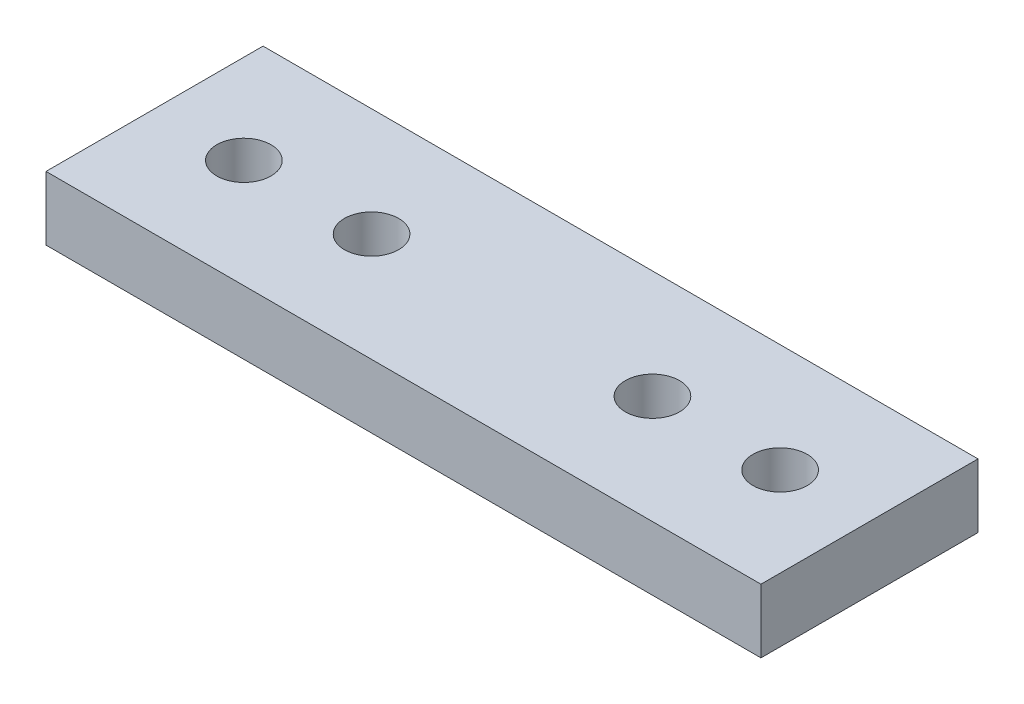
ISO-10303-21;
HEADER;
FILE_DESCRIPTION(('STEP AP214'),'2;1');
FILE_NAME('part.step','',(''),(''),'','','');
FILE_SCHEMA(('AUTOMOTIVE_DESIGN { 1 0 10303 214 1 1 1 1 }'));
ENDSEC;
DATA;
#1=APPLICATION_CONTEXT('core data for automotive mechanical design processes');
#2=APPLICATION_PROTOCOL_DEFINITION('international standard','automotive_design',2000,#1);
#3=PRODUCT_CONTEXT('',#1,'mechanical');
#4=PRODUCT('Part','Part','',(#3));
#5=PRODUCT_RELATED_PRODUCT_CATEGORY('part','',(#4));
#6=PRODUCT_DEFINITION_FORMATION('','',#4);
#7=PRODUCT_DEFINITION_CONTEXT('part definition',#1,'design');
#8=PRODUCT_DEFINITION('design','',#6,#7);
#9=PRODUCT_DEFINITION_SHAPE('','',#8);
#10=(LENGTH_UNIT() NAMED_UNIT(*) SI_UNIT(.MILLI.,.METRE.));
#11=(NAMED_UNIT(*) PLANE_ANGLE_UNIT() SI_UNIT($,.RADIAN.));
#12=(NAMED_UNIT(*) SI_UNIT($,.STERADIAN.) SOLID_ANGLE_UNIT());
#13=UNCERTAINTY_MEASURE_WITH_UNIT(LENGTH_MEASURE(1.E-05),#10,'distance_accuracy_value','');
#14=(GEOMETRIC_REPRESENTATION_CONTEXT(3) GLOBAL_UNCERTAINTY_ASSIGNED_CONTEXT((#13)) GLOBAL_UNIT_ASSIGNED_CONTEXT((#10,
#11,#12)) REPRESENTATION_CONTEXT('',''));
#15=CARTESIAN_POINT('',(0.,0.,0.));
#16=DIRECTION('',(0.,0.,1.));
#17=DIRECTION('',(1.,0.,0.));
#18=AXIS2_PLACEMENT_3D('',#15,#16,#17);
#19=CARTESIAN_POINT('',(0.,10.,0.));
#20=DIRECTION('',(0.,-1.,0.));
#21=DIRECTION('',(0.,0.,-1.));
#22=AXIS2_PLACEMENT_3D('',#19,#20,#21);
#23=PLANE('',#22);
#24=DIRECTION('',(0.,0.,1.));
#25=VECTOR('',#24,1.);
#26=CARTESIAN_POINT('',(-56.,10.,17.));
#27=LINE('',#26,#25);
#28=CARTESIAN_POINT('',(-56.,10.,-17.));
#29=VERTEX_POINT('',#28);
#30=CARTESIAN_POINT('',(-56.,10.,17.));
#31=VERTEX_POINT('',#30);
#32=EDGE_CURVE('E91',#29,#31,#27,.T.);
#33=ORIENTED_EDGE('',*,*,#32,.T.);
#34=DIRECTION('',(1.,0.,0.));
#35=VECTOR('',#34,1.);
#36=CARTESIAN_POINT('',(-56.,10.,17.));
#37=LINE('',#36,#35);
#38=CARTESIAN_POINT('',(56.,10.,17.));
#39=VERTEX_POINT('',#38);
#40=EDGE_CURVE('E86',#31,#39,#37,.T.);
#41=ORIENTED_EDGE('',*,*,#40,.T.);
#42=DIRECTION('',(0.,0.,-1.));
#43=VECTOR('',#42,1.);
#44=CARTESIAN_POINT('',(56.,10.,17.));
#45=LINE('',#44,#43);
#46=CARTESIAN_POINT('',(56.,10.,-17.));
#47=VERTEX_POINT('',#46);
#48=EDGE_CURVE('E87',#39,#47,#45,.T.);
#49=ORIENTED_EDGE('',*,*,#48,.T.);
#50=DIRECTION('',(-1.,0.,0.));
#51=VECTOR('',#50,1.);
#52=CARTESIAN_POINT('',(-56.,10.,-17.));
#53=LINE('',#52,#51);
#54=EDGE_CURVE('E57',#47,#29,#53,.T.);
#55=ORIENTED_EDGE('',*,*,#54,.T.);
#56=EDGE_LOOP('',(#33,#41,#49,#55));
#57=FACE_BOUND('',#56,.T.);
#58=CARTESIAN_POINT('',(-42.,10.,0.));
#59=DIRECTION('',(0.,1.,0.));
#60=DIRECTION('',(0.,0.,1.));
#61=AXIS2_PLACEMENT_3D('',#58,#59,#60);
#62=CIRCLE('',#61,4.25);
#63=CARTESIAN_POINT('',(-42.,10.,4.25));
#64=VERTEX_POINT('',#63);
#65=EDGE_CURVE('E106',#64,#64,#62,.T.);
#66=ORIENTED_EDGE('',*,*,#65,.F.);
#67=EDGE_LOOP('',(#66));
#68=FACE_BOUND('',#67,.T.);
#69=CARTESIAN_POINT('',(42.,10.,0.));
#70=DIRECTION('',(0.,1.,0.));
#71=DIRECTION('',(0.,0.,1.));
#72=AXIS2_PLACEMENT_3D('',#69,#70,#71);
#73=CIRCLE('',#72,4.25);
#74=CARTESIAN_POINT('',(42.,10.,4.25));
#75=VERTEX_POINT('',#74);
#76=EDGE_CURVE('E123',#75,#75,#73,.T.);
#77=ORIENTED_EDGE('',*,*,#76,.F.);
#78=EDGE_LOOP('',(#77));
#79=FACE_BOUND('',#78,.T.);
#80=CARTESIAN_POINT('',(-22.,10.,0.));
#81=DIRECTION('',(0.,1.,0.));
#82=DIRECTION('',(0.,0.,1.));
#83=AXIS2_PLACEMENT_3D('',#80,#81,#82);
#84=CIRCLE('',#83,4.25);
#85=CARTESIAN_POINT('',(-22.,10.,4.25));
#86=VERTEX_POINT('',#85);
#87=EDGE_CURVE('E130',#86,#86,#84,.T.);
#88=ORIENTED_EDGE('',*,*,#87,.F.);
#89=EDGE_LOOP('',(#88));
#90=FACE_BOUND('',#89,.T.);
#91=CARTESIAN_POINT('',(22.,10.,0.));
#92=DIRECTION('',(0.,1.,0.));
#93=DIRECTION('',(0.,0.,1.));
#94=AXIS2_PLACEMENT_3D('',#91,#92,#93);
#95=CIRCLE('',#94,4.25);
#96=CARTESIAN_POINT('',(22.,10.,4.25));
#97=VERTEX_POINT('',#96);
#98=EDGE_CURVE('E133',#97,#97,#95,.T.);
#99=ORIENTED_EDGE('',*,*,#98,.F.);
#100=EDGE_LOOP('',(#99));
#101=FACE_BOUND('',#100,.T.);
#102=ADVANCED_FACE('F39',(#57,#68,#79,#90,#101),#23,.F.);
#103=CARTESIAN_POINT('',(0.,0.,0.));
#104=DIRECTION('',(0.,-1.,0.));
#105=DIRECTION('',(0.,0.,-1.));
#106=AXIS2_PLACEMENT_3D('',#103,#104,#105);
#107=PLANE('',#106);
#108=CARTESIAN_POINT('',(-22.,0.,0.));
#109=DIRECTION('',(0.,1.,0.));
#110=DIRECTION('',(0.,0.,1.));
#111=AXIS2_PLACEMENT_3D('',#108,#109,#110);
#112=CIRCLE('',#111,4.25);
#113=CARTESIAN_POINT('',(-22.,0.,4.25));
#114=VERTEX_POINT('',#113);
#115=EDGE_CURVE('E127',#114,#114,#112,.T.);
#116=ORIENTED_EDGE('',*,*,#115,.T.);
#117=EDGE_LOOP('',(#116));
#118=FACE_BOUND('',#117,.T.);
#119=CARTESIAN_POINT('',(-42.,0.,0.));
#120=DIRECTION('',(0.,1.,0.));
#121=DIRECTION('',(0.,0.,1.));
#122=AXIS2_PLACEMENT_3D('',#119,#120,#121);
#123=CIRCLE('',#122,4.25);
#124=CARTESIAN_POINT('',(-42.,0.,4.25));
#125=VERTEX_POINT('',#124);
#126=EDGE_CURVE('E119',#125,#125,#123,.T.);
#127=ORIENTED_EDGE('',*,*,#126,.T.);
#128=EDGE_LOOP('',(#127));
#129=FACE_BOUND('',#128,.T.);
#130=DIRECTION('',(0.,0.,1.));
#131=VECTOR('',#130,1.);
#132=CARTESIAN_POINT('',(-56.,0.,17.));
#133=LINE('',#132,#131);
#134=CARTESIAN_POINT('',(-56.,0.,-17.));
#135=VERTEX_POINT('',#134);
#136=CARTESIAN_POINT('',(-56.,0.,17.));
#137=VERTEX_POINT('',#136);
#138=EDGE_CURVE('E104',#135,#137,#133,.T.);
#139=ORIENTED_EDGE('',*,*,#138,.F.);
#140=DIRECTION('',(-1.,0.,0.));
#141=VECTOR('',#140,1.);
#142=CARTESIAN_POINT('',(-56.,0.,-17.));
#143=LINE('',#142,#141);
#144=CARTESIAN_POINT('',(56.,0.,-17.));
#145=VERTEX_POINT('',#144);
#146=EDGE_CURVE('E80',#145,#135,#143,.T.);
#147=ORIENTED_EDGE('',*,*,#146,.F.);
#148=DIRECTION('',(0.,0.,-1.));
#149=VECTOR('',#148,1.);
#150=CARTESIAN_POINT('',(56.,0.,17.));
#151=LINE('',#150,#149);
#152=CARTESIAN_POINT('',(56.,0.,17.));
#153=VERTEX_POINT('',#152);
#154=EDGE_CURVE('E74',#153,#145,#151,.T.);
#155=ORIENTED_EDGE('',*,*,#154,.F.);
#156=DIRECTION('',(1.,0.,0.));
#157=VECTOR('',#156,1.);
#158=CARTESIAN_POINT('',(-56.,0.,17.));
#159=LINE('',#158,#157);
#160=EDGE_CURVE('E94',#137,#153,#159,.T.);
#161=ORIENTED_EDGE('',*,*,#160,.F.);
#162=EDGE_LOOP('',(#139,#147,#155,#161));
#163=FACE_BOUND('',#162,.T.);
#164=CARTESIAN_POINT('',(42.,0.,0.));
#165=DIRECTION('',(0.,1.,0.));
#166=DIRECTION('',(0.,0.,1.));
#167=AXIS2_PLACEMENT_3D('',#164,#165,#166);
#168=CIRCLE('',#167,4.25);
#169=CARTESIAN_POINT('',(42.,0.,4.25));
#170=VERTEX_POINT('',#169);
#171=EDGE_CURVE('E125',#170,#170,#168,.T.);
#172=ORIENTED_EDGE('',*,*,#171,.T.);
#173=EDGE_LOOP('',(#172));
#174=FACE_BOUND('',#173,.T.);
#175=CARTESIAN_POINT('',(22.,0.,0.));
#176=DIRECTION('',(0.,1.,0.));
#177=DIRECTION('',(0.,0.,1.));
#178=AXIS2_PLACEMENT_3D('',#175,#176,#177);
#179=CIRCLE('',#178,4.25);
#180=CARTESIAN_POINT('',(22.,0.,4.25));
#181=VERTEX_POINT('',#180);
#182=EDGE_CURVE('E136',#181,#181,#179,.T.);
#183=ORIENTED_EDGE('',*,*,#182,.T.);
#184=EDGE_LOOP('',(#183));
#185=FACE_BOUND('',#184,.T.);
#186=ADVANCED_FACE('F114',(#118,#129,#163,#174,#185),#107,.T.);
#187=CARTESIAN_POINT('',(-56.,10.,17.));
#188=DIRECTION('',(1.,0.,0.));
#189=DIRECTION('',(0.,0.,-1.));
#190=AXIS2_PLACEMENT_3D('',#187,#188,#189);
#191=PLANE('',#190);
#192=ORIENTED_EDGE('',*,*,#138,.T.);
#193=DIRECTION('',(0.,-1.,0.));
#194=VECTOR('',#193,1.);
#195=CARTESIAN_POINT('',(-56.,10.,17.));
#196=LINE('',#195,#194);
#197=EDGE_CURVE('E11',#31,#137,#196,.T.);
#198=ORIENTED_EDGE('',*,*,#197,.F.);
#199=ORIENTED_EDGE('',*,*,#32,.F.);
#200=DIRECTION('',(0.,-1.,0.));
#201=VECTOR('',#200,1.);
#202=CARTESIAN_POINT('',(-56.,10.,-17.));
#203=LINE('',#202,#201);
#204=EDGE_CURVE('E98',#29,#135,#203,.T.);
#205=ORIENTED_EDGE('',*,*,#204,.T.);
#206=EDGE_LOOP('',(#192,#198,#199,#205));
#207=FACE_BOUND('',#206,.T.);
#208=ADVANCED_FACE('F41',(#207),#191,.F.);
#209=CARTESIAN_POINT('',(-56.,10.,17.));
#210=DIRECTION('',(0.,0.,-1.));
#211=DIRECTION('',(-1.,0.,0.));
#212=AXIS2_PLACEMENT_3D('',#209,#210,#211);
#213=PLANE('',#212);
#214=ORIENTED_EDGE('',*,*,#160,.T.);
#215=DIRECTION('',(0.,-1.,0.));
#216=VECTOR('',#215,1.);
#217=CARTESIAN_POINT('',(56.,10.,17.));
#218=LINE('',#217,#216);
#219=EDGE_CURVE('E48',#39,#153,#218,.T.);
#220=ORIENTED_EDGE('',*,*,#219,.F.);
#221=ORIENTED_EDGE('',*,*,#40,.F.);
#222=ORIENTED_EDGE('',*,*,#197,.T.);
#223=EDGE_LOOP('',(#214,#220,#221,#222));
#224=FACE_BOUND('',#223,.T.);
#225=ADVANCED_FACE('F92',(#224),#213,.F.);
#226=CARTESIAN_POINT('',(56.,10.,17.));
#227=DIRECTION('',(-1.,0.,0.));
#228=DIRECTION('',(0.,0.,1.));
#229=AXIS2_PLACEMENT_3D('',#226,#227,#228);
#230=PLANE('',#229);
#231=ORIENTED_EDGE('',*,*,#154,.T.);
#232=DIRECTION('',(0.,-1.,0.));
#233=VECTOR('',#232,1.);
#234=CARTESIAN_POINT('',(56.,10.,-17.));
#235=LINE('',#234,#233);
#236=EDGE_CURVE('E96',#47,#145,#235,.T.);
#237=ORIENTED_EDGE('',*,*,#236,.F.);
#238=ORIENTED_EDGE('',*,*,#48,.F.);
#239=ORIENTED_EDGE('',*,*,#219,.T.);
#240=EDGE_LOOP('',(#231,#237,#238,#239));
#241=FACE_BOUND('',#240,.T.);
#242=ADVANCED_FACE('F100',(#241),#230,.F.);
#243=CARTESIAN_POINT('',(-56.,10.,-17.));
#244=DIRECTION('',(0.,0.,1.));
#245=DIRECTION('',(1.,0.,0.));
#246=AXIS2_PLACEMENT_3D('',#243,#244,#245);
#247=PLANE('',#246);
#248=ORIENTED_EDGE('',*,*,#146,.T.);
#249=ORIENTED_EDGE('',*,*,#204,.F.);
#250=ORIENTED_EDGE('',*,*,#54,.F.);
#251=ORIENTED_EDGE('',*,*,#236,.T.);
#252=EDGE_LOOP('',(#248,#249,#250,#251));
#253=FACE_BOUND('',#252,.T.);
#254=ADVANCED_FACE('F112',(#253),#247,.F.);
#255=CARTESIAN_POINT('',(-42.,10.,0.));
#256=DIRECTION('',(0.,-1.,0.));
#257=DIRECTION('',(0.,0.,-1.));
#258=AXIS2_PLACEMENT_3D('',#255,#256,#257);
#259=CYLINDRICAL_SURFACE('',#258,4.25);
#260=ORIENTED_EDGE('',*,*,#65,.T.);
#261=EDGE_LOOP('',(#260));
#262=FACE_BOUND('',#261,.T.);
#263=ORIENTED_EDGE('',*,*,#126,.F.);
#264=EDGE_LOOP('',(#263));
#265=FACE_BOUND('',#264,.T.);
#266=ADVANCED_FACE('F154',(#262,#265),#259,.F.);
#267=CARTESIAN_POINT('',(42.,10.,0.));
#268=DIRECTION('',(0.,-1.,0.));
#269=DIRECTION('',(0.,0.,-1.));
#270=AXIS2_PLACEMENT_3D('',#267,#268,#269);
#271=CYLINDRICAL_SURFACE('',#270,4.25);
#272=ORIENTED_EDGE('',*,*,#76,.T.);
#273=EDGE_LOOP('',(#272));
#274=FACE_BOUND('',#273,.T.);
#275=ORIENTED_EDGE('',*,*,#171,.F.);
#276=EDGE_LOOP('',(#275));
#277=FACE_BOUND('',#276,.T.);
#278=ADVANCED_FACE('F199',(#274,#277),#271,.F.);
#279=CARTESIAN_POINT('',(-22.,10.,0.));
#280=DIRECTION('',(0.,-1.,0.));
#281=DIRECTION('',(0.,0.,-1.));
#282=AXIS2_PLACEMENT_3D('',#279,#280,#281);
#283=CYLINDRICAL_SURFACE('',#282,4.25);
#284=ORIENTED_EDGE('',*,*,#87,.T.);
#285=EDGE_LOOP('',(#284));
#286=FACE_BOUND('',#285,.T.);
#287=ORIENTED_EDGE('',*,*,#115,.F.);
#288=EDGE_LOOP('',(#287));
#289=FACE_BOUND('',#288,.T.);
#290=ADVANCED_FACE('F206',(#286,#289),#283,.F.);
#291=CARTESIAN_POINT('',(22.,10.,0.));
#292=DIRECTION('',(0.,-1.,0.));
#293=DIRECTION('',(0.,0.,-1.));
#294=AXIS2_PLACEMENT_3D('',#291,#292,#293);
#295=CYLINDRICAL_SURFACE('',#294,4.25);
#296=ORIENTED_EDGE('',*,*,#98,.T.);
#297=EDGE_LOOP('',(#296));
#298=FACE_BOUND('',#297,.T.);
#299=ORIENTED_EDGE('',*,*,#182,.F.);
#300=EDGE_LOOP('',(#299));
#301=FACE_BOUND('',#300,.T.);
#302=ADVANCED_FACE('F145',(#298,#301),#295,.F.);
#303=CLOSED_SHELL('',(#102,#186,#208,#225,#242,#254,#266,#278,#290,#302));
#304=MANIFOLD_SOLID_BREP('B2',#303);
#305=ADVANCED_BREP_SHAPE_REPRESENTATION('',(#18,#304),#14);
#306=SHAPE_DEFINITION_REPRESENTATION(#9,#305);
ENDSEC;
END-ISO-10303-21;
